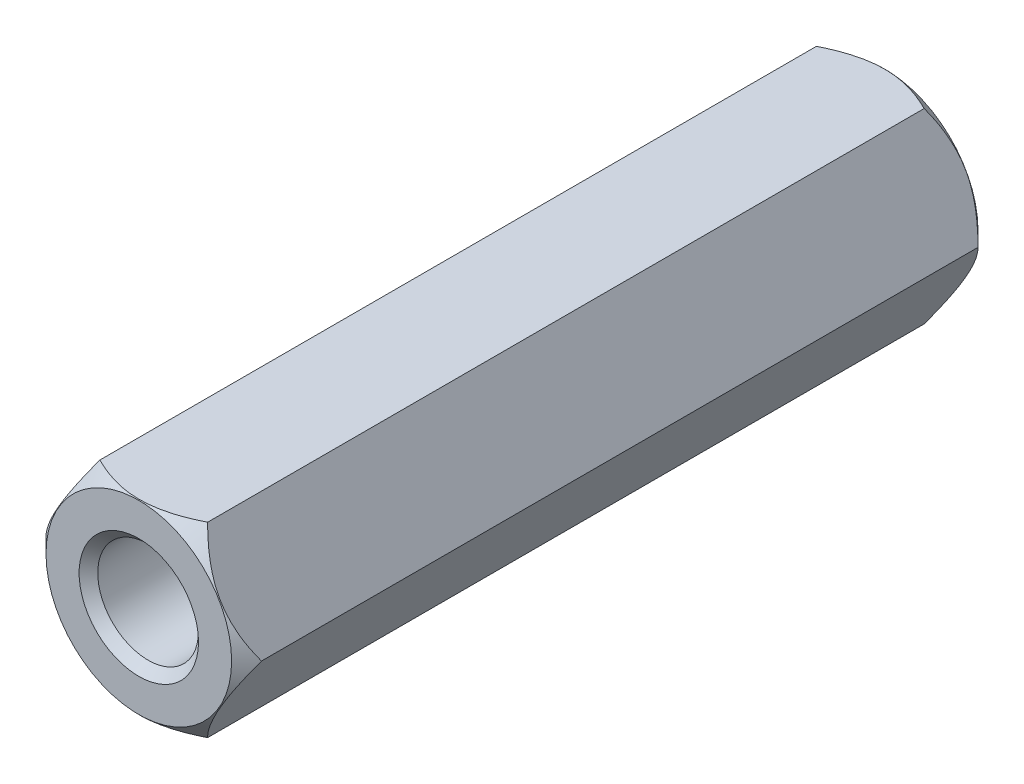
ISO-10303-21;
HEADER;
FILE_DESCRIPTION(('STEP AP214'),'2;1');
FILE_NAME('part.step','',(''),(''),'','','');
FILE_SCHEMA(('AUTOMOTIVE_DESIGN { 1 0 10303 214 1 1 1 1 }'));
ENDSEC;
DATA;
#1=APPLICATION_CONTEXT('core data for automotive mechanical design processes');
#2=APPLICATION_PROTOCOL_DEFINITION('international standard','automotive_design',2000,#1);
#3=PRODUCT_CONTEXT('',#1,'mechanical');
#4=PRODUCT('Part','Part','',(#3));
#5=PRODUCT_RELATED_PRODUCT_CATEGORY('part','',(#4));
#6=PRODUCT_DEFINITION_FORMATION('','',#4);
#7=PRODUCT_DEFINITION_CONTEXT('part definition',#1,'design');
#8=PRODUCT_DEFINITION('design','',#6,#7);
#9=PRODUCT_DEFINITION_SHAPE('','',#8);
#10=(LENGTH_UNIT() NAMED_UNIT(*) SI_UNIT(.MILLI.,.METRE.));
#11=(NAMED_UNIT(*) PLANE_ANGLE_UNIT() SI_UNIT($,.RADIAN.));
#12=(NAMED_UNIT(*) SI_UNIT($,.STERADIAN.) SOLID_ANGLE_UNIT());
#13=UNCERTAINTY_MEASURE_WITH_UNIT(LENGTH_MEASURE(1.E-05),#10,'distance_accuracy_value','');
#14=(GEOMETRIC_REPRESENTATION_CONTEXT(3) GLOBAL_UNCERTAINTY_ASSIGNED_CONTEXT((#13)) GLOBAL_UNIT_ASSIGNED_CONTEXT((#10,
#11,#12)) REPRESENTATION_CONTEXT('',''));
#15=CARTESIAN_POINT('',(0.,0.,0.));
#16=DIRECTION('',(0.,0.,1.));
#17=DIRECTION('',(1.,0.,0.));
#18=AXIS2_PLACEMENT_3D('',#15,#16,#17);
#19=CARTESIAN_POINT('',(1.44337567297409,-2.49999999999998,10.));
#20=DIRECTION('',(-0.866025403784442,0.499999999999995,0.));
#21=DIRECTION('',(-0.499999999999995,-0.866025403784442,0.));
#22=AXIS2_PLACEMENT_3D('',#19,#20,#21);
#23=PLANE('',#22);
#24=DIRECTION('',(0.,0.,1.));
#25=VECTOR('',#24,1.);
#26=CARTESIAN_POINT('',(1.44337567297409,-2.49999999999998,10.));
#27=LINE('',#26,#25);
#28=CARTESIAN_POINT('',(1.44337563618274,-2.49999999999998,9.60000001837968));
#29=VERTEX_POINT('',#28);
#30=CARTESIAN_POINT('',(1.44337569136929,-2.49999996813856,-9.6000000183792));
#31=VERTEX_POINT('',#30);
#32=EDGE_CURVE('E230',#29,#31,#27,.F.);
#33=ORIENTED_EDGE('',*,*,#32,.T.);
#34=CARTESIAN_POINT('',(2.88675134594212,-1.04069278974733E-11,-9.59999999999001));
#35=CARTESIAN_POINT('',(2.83714181918158,-0.0859262208991219,-9.64956191747157));
#36=CARTESIAN_POINT('',(2.786702820116,-0.173289129963614,-9.69621249947469));
#37=CARTESIAN_POINT('',(2.6838525248583,-0.351431066923417,-9.78162772360386));
#38=CARTESIAN_POINT('',(2.63143145294231,-0.442227026869141,-9.8203448562568));
#39=CARTESIAN_POINT('',(2.52572693266097,-0.625312626586108,-9.88666756505103));
#40=CARTESIAN_POINT('',(2.47247038953809,-0.717555665110433,-9.91443979581393));
#41=CARTESIAN_POINT('',(2.36478518620404,-0.90407190850839,-9.95722820692158));
#42=CARTESIAN_POINT('',(2.31035981325604,-0.998339419675211,-9.97227631522407));
#43=CARTESIAN_POINT('',(2.21655517569398,-1.16081381791828,-9.98585394949267));
#44=CARTESIAN_POINT('',(2.17729701313281,-1.22881095008603,-9.9878632717914));
#45=CARTESIAN_POINT('',(2.0988449207004,-1.36469396013906,-9.98447379973764));
#46=CARTESIAN_POINT('',(2.05965101816335,-1.43257979068014,-9.97907240877419));
#47=CARTESIAN_POINT('',(1.98163336093658,-1.56771033688439,-9.9611688890714));
#48=CARTESIAN_POINT('',(1.94281006951967,-1.63495425013553,-9.94865882136555));
#49=CARTESIAN_POINT('',(1.86583485788706,-1.76827922760658,-9.91722463177757));
#50=CARTESIAN_POINT('',(1.82768288641859,-1.83436038059889,-9.89830100180163));
#51=CARTESIAN_POINT('',(1.72998211153384,-2.00358308663813,-9.84213570260467));
#52=CARTESIAN_POINT('',(1.67103848733788,-2.10567643852777,-9.80066503729295));
#53=CARTESIAN_POINT('',(1.58436641863271,-2.25579686512223,-9.73065889047827));
#54=CARTESIAN_POINT('',(1.55580401039015,-2.30526840738488,-9.70606226599826));
#55=CARTESIAN_POINT('',(1.49920805534087,-2.40329547703312,-9.65462717783725));
#56=CARTESIAN_POINT('',(1.47117419715315,-2.45185154374643,-9.62779008808809));
#57=CARTESIAN_POINT('',(1.44337570976449,-2.49999993627714,-9.6000000367744));
#58=B_SPLINE_CURVE_WITH_KNOTS('',3,(#34,#35,#36,#37,#38,#39,#40,#41,#42,#43,#44,#45,#46,#47,#48,
#49,#50,#51,#52,#53,#54,#55,#56,#57),.UNSPECIFIED.,.F.,.F.,(4,2,2,2,2,2,2,2,2,2,2,4),(0.,
0.332957366238637,0.667853853239961,0.997433316819248,1.32618330924561,1.56147590701701,
1.79685096910278,2.03248941602696,2.26810979408609,2.64223178462184,2.82878531071778,
3.01522526436453),.UNSPECIFIED.);
#59=CARTESIAN_POINT('',(2.88675134596093,5.20299159348622E-12,-9.59999999996733));
#60=VERTEX_POINT('',#59);
#61=EDGE_CURVE('E95',#60,#31,#58,.T.);
#62=ORIENTED_EDGE('',*,*,#61,.F.);
#63=DIRECTION('',(0.,0.,1.));
#64=VECTOR('',#63,1.);
#65=CARTESIAN_POINT('',(2.88675134594813,0.,10.));
#66=LINE('',#65,#64);
#67=CARTESIAN_POINT('',(2.88675134596093,5.20345800689672E-12,9.59999999997188));
#68=VERTEX_POINT('',#67);
#69=EDGE_CURVE('E65',#60,#68,#66,.T.);
#70=ORIENTED_EDGE('',*,*,#69,.T.);
#71=CARTESIAN_POINT('',(1.44337563567651,-2.50000000332945,9.59999997242365));
#72=CARTESIAN_POINT('',(1.49298517776217,-2.41407379512151,9.64956189970784));
#73=CARTESIAN_POINT('',(1.54342418333656,-2.32671089091068,9.69621248639307));
#74=CARTESIAN_POINT('',(1.64627448377538,-2.14856895685125,9.78162771530144));
#75=CARTESIAN_POINT('',(1.69869555431559,-2.05777299491628,9.82034484803819));
#76=CARTESIAN_POINT('',(1.80440007385888,-1.87468739333832,9.88666755815194));
#77=CARTESIAN_POINT('',(1.8576566175802,-1.78244435492245,9.91443979016234));
#78=CARTESIAN_POINT('',(1.96534182164278,-1.59592811108585,9.95722820347616));
#79=CARTESIAN_POINT('',(2.01976719472307,-1.50166059937181,9.97227631272916));
#80=CARTESIAN_POINT('',(2.11357183230898,-1.33918620092785,9.9858539485665));
#81=CARTESIAN_POINT('',(2.15282999470135,-1.27118906910121,9.98786327156027));
#82=CARTESIAN_POINT('',(2.23128208679212,-1.1353060596756,9.98447380094104));
#83=CARTESIAN_POINT('',(2.27047598915637,-1.06742022942076,9.9790724107199));
#84=CARTESIAN_POINT('',(2.34849364612868,-0.932289683647671,9.96116889251074));
#85=CARTESIAN_POINT('',(2.38731693746344,-0.865045770542311,9.94865882554704));
#86=CARTESIAN_POINT('',(2.46429214896062,-0.731720793308433,9.91722463740315));
#87=CARTESIAN_POINT('',(2.50244412037571,-0.665639640407685,9.89830100812817));
#88=CARTESIAN_POINT('',(2.60014490400861,-0.49641691921513,9.84213570557291));
#89=CARTESIAN_POINT('',(2.65908853672397,-0.394323552569988,9.80066503408387));
#90=CARTESIAN_POINT('',(2.7457606176825,-0.244203104752272,9.73065887595901));
#91=CARTESIAN_POINT('',(2.77432302990582,-0.194731555594734,9.70606224738653));
#92=CARTESIAN_POINT('',(2.83091899276502,-0.0967044724192528,9.65462715050661));
#93=CARTESIAN_POINT('',(2.85895285478217,-0.0481483990731404,9.62779005613214));
#94=CARTESIAN_POINT('',(2.88675134594212,-1.04076022762005E-11,9.59999999999001));
#95=B_SPLINE_CURVE_WITH_KNOTS('',3,(#71,#72,#73,#74,#75,#76,#77,#78,#79,#80,#81,#82,#83,#84,#85,
#86,#87,#88,#89,#90,#91,#92,#93,#94),.UNSPECIFIED.,.F.,.F.,(4,2,2,2,2,2,2,2,2,2,2,4),(0.,
0.332957369514969,0.667853859275593,0.997433324550427,1.32618331889992,1.56147591560538,
1.79685097653576,2.03248942260823,2.26810979985238,2.64223184439946,2.82878539728016,
3.01522537763104),.UNSPECIFIED.);
#96=EDGE_CURVE('E94',#29,#68,#95,.T.);
#97=ORIENTED_EDGE('',*,*,#96,.F.);
#98=EDGE_LOOP('',(#33,#62,#70,#97));
#99=FACE_BOUND('',#98,.T.);
#100=ADVANCED_FACE('F47',(#99),#23,.F.);
#101=CARTESIAN_POINT('',(-1.44337567297404,-2.50000000000001,10.));
#102=DIRECTION('',(0.,1.,0.));
#103=DIRECTION('',(-1.,0.,0.));
#104=AXIS2_PLACEMENT_3D('',#101,#102,#103);
#105=PLANE('',#104);
#106=DIRECTION('',(0.,0.,1.));
#107=VECTOR('',#106,1.);
#108=CARTESIAN_POINT('',(-1.44337567297404,-2.50000000000002,10.));
#109=LINE('',#108,#107);
#110=CARTESIAN_POINT('',(-1.4433756913615,-2.49999996815201,9.60000001837146));
#111=VERTEX_POINT('',#110);
#112=CARTESIAN_POINT('',(-1.44337563619152,-2.50000000000002,-9.60000001837526));
#113=VERTEX_POINT('',#112);
#114=EDGE_CURVE('E351',#111,#113,#109,.F.);
#115=ORIENTED_EDGE('',*,*,#114,.T.);
#116=CARTESIAN_POINT('',(1.44337569453235,-2.49999996936722,-9.59999997241236));
#117=CARTESIAN_POINT('',(1.34415664439094,-2.49999998897752,-9.64956189966595));
#118=CARTESIAN_POINT('',(1.2432786472718,-2.49999999704033,-9.69621248632457));
#119=CARTESIAN_POINT('',(1.03757805680784,-2.50000000297688,-9.78162771519184));
#120=CARTESIAN_POINT('',(0.932735912008235,-2.50000000079102,-9.82034484791412));
#121=CARTESIAN_POINT('',(0.721326870207063,-2.49999999922152,-9.88666755805676));
#122=CARTESIAN_POINT('',(0.614813783688683,-2.49999999979395,-9.9144397900973));
#123=CARTESIAN_POINT('',(0.399443376138141,-2.50000000020552,-9.95722820345589));
#124=CARTESIAN_POINT('',(0.290592629631135,-2.5000000000465,-9.97227631272363));
#125=CARTESIAN_POINT('',(0.102983354225016,-2.49999999996672,-9.98585394856818));
#126=CARTESIAN_POINT('',(0.0244670294578231,-2.49999999999108,-9.98786327156152));
#127=CARTESIAN_POINT('',(-0.132437154742351,-2.50000000000892,-9.98447380093674));
#128=CARTESIAN_POINT('',(-0.210824959507029,-2.5000000000024,-9.97907241071048));
#129=CARTESIAN_POINT('',(-0.366860273459843,-2.49999999999761,-9.9611688924925));
#130=CARTESIAN_POINT('',(-0.444506856101901,-2.49999999999935,-9.94865882552954));
#131=CARTESIAN_POINT('',(-0.598457279045725,-2.50000000000066,-9.91722463739126));
#132=CARTESIAN_POINT('',(-0.674761221852855,-2.50000000000021,-9.89830100812125));
#133=CARTESIAN_POINT('',(-0.870162775880793,-2.49999999999968,-9.84213570937134));
#134=CARTESIAN_POINT('',(-0.988050028534472,-2.49999999999994,-9.80066504322648));
#135=CARTESIAN_POINT('',(-1.16139417205809,-2.50000000000004,-9.73065889456052));
#136=CARTESIAN_POINT('',(-1.21851899051716,-2.50000000000003,-9.70606226937212));
#137=CARTESIAN_POINT('',(-1.33171090448867,-2.5,-9.65462717963245));
#138=CARTESIAN_POINT('',(-1.38777862276322,-2.49999999999998,-9.62779008901326));
#139=CARTESIAN_POINT('',(-1.44337559940901,-2.50000000000001,-9.60000003676652));
#140=B_SPLINE_CURVE_WITH_KNOTS('',3,(#116,#117,#118,#119,#120,#121,#122,#123,#124,#125,#126,
#127,#128,#129,#130,#131,#132,#133,#134,#135,#136,#137,#138,#139),.UNSPECIFIED.,.F.,.F.,(4,2,2,
2,2,2,2,2,2,2,2,4),(0.,0.332957369311108,0.667853858868545,0.99743332436055,1.32618331892517,
1.56147591570433,1.79685097670962,2.03248942271044,2.26810979987908,2.6422318032004,
2.82878533557299,3.0152252954817),.UNSPECIFIED.);
#141=EDGE_CURVE('E256',#31,#113,#140,.T.);
#142=ORIENTED_EDGE('',*,*,#141,.F.);
#143=ORIENTED_EDGE('',*,*,#32,.F.);
#144=CARTESIAN_POINT('',(-1.44337569450378,-2.49999996937842,9.59999997243274));
#145=CARTESIAN_POINT('',(-1.34415664436238,-2.49999998898157,9.64956189968163));
#146=CARTESIAN_POINT('',(-1.24327864724414,-2.49999999704143,9.69621248633742));
#147=CARTESIAN_POINT('',(-1.03757805678284,-2.50000000297582,9.78162771520081));
#148=CARTESIAN_POINT('',(-0.932735911984984,-2.50000000079075,9.82034484792204));
#149=CARTESIAN_POINT('',(-0.721326870187105,-2.49999999922182,9.88666755806239));
#150=CARTESIAN_POINT('',(-0.614813783670263,-2.49999999979404,9.91443979010167));
#151=CARTESIAN_POINT('',(-0.399443376123012,-2.50000000020545,9.95722820345817));
#152=CARTESIAN_POINT('',(-0.290592629617759,-2.50000000004649,9.97227631272508));
#153=CARTESIAN_POINT('',(-0.102983354213352,-2.49999999996673,9.98585394856867));
#154=CARTESIAN_POINT('',(-0.0244670294460898,-2.49999999999108,9.98786327156164));
#155=CARTESIAN_POINT('',(0.132437154754195,-2.50000000000892,9.98447380093612));
#156=CARTESIAN_POINT('',(0.210824959518913,-2.50000000000239,9.97907241070948));
#157=CARTESIAN_POINT('',(0.366860273471757,-2.4999999999976,9.96116889249078));
#158=CARTESIAN_POINT('',(0.444506856113803,-2.49999999999934,9.94865882552746));
#159=CARTESIAN_POINT('',(0.598457279057579,-2.50000000000064,9.91722463738851));
#160=CARTESIAN_POINT('',(0.674761221864673,-2.5000000000002,9.89830100811818));
#161=CARTESIAN_POINT('',(0.870162775887302,-2.49999999999966,9.84213570936899));
#162=CARTESIAN_POINT('',(0.988050028535874,-2.49999999999992,9.8006650432258));
#163=CARTESIAN_POINT('',(1.16139417205213,-2.50000000000002,9.73065889456301));
#164=CARTESIAN_POINT('',(1.21851899050881,-2.5,9.70606226937577));
#165=CARTESIAN_POINT('',(1.33171090447562,-2.49999999999997,9.65462717963858));
#166=CARTESIAN_POINT('',(1.38777862274786,-2.49999999999995,9.62779008902071));
#167=CARTESIAN_POINT('',(1.44337559939138,-2.49999999999998,9.60000003677536));
#168=B_SPLINE_CURVE_WITH_KNOTS('',3,(#144,#145,#146,#147,#148,#149,#150,#151,#152,#153,#154,
#155,#156,#157,#158,#159,#160,#161,#162,#163,#164,#165,#166,#167),.UNSPECIFIED.,.F.,.F.,(4,2,2,
2,2,2,2,2,2,2,2,4),(0.,0.332957369305103,0.667853858856614,0.997433324343167,1.3261833189023,
1.56147591568163,1.79685097668713,2.03248942268809,2.26810979985685,2.64223180316216,
2.82878533552677,3.01522529542753),.UNSPECIFIED.);
#169=EDGE_CURVE('E110',#111,#29,#168,.T.);
#170=ORIENTED_EDGE('',*,*,#169,.F.);
#171=EDGE_LOOP('',(#115,#142,#143,#170));
#172=FACE_BOUND('',#171,.T.);
#173=ADVANCED_FACE('F182',(#172),#105,.F.);
#174=CARTESIAN_POINT('',(-2.88675134594813,0.,10.));
#175=DIRECTION('',(0.866025403784435,0.500000000000007,0.));
#176=DIRECTION('',(-0.500000000000007,0.866025403784435,0.));
#177=AXIS2_PLACEMENT_3D('',#174,#175,#176);
#178=PLANE('',#177);
#179=DIRECTION('',(0.,0.,1.));
#180=VECTOR('',#179,1.);
#181=CARTESIAN_POINT('',(-2.88675134594813,0.,10.));
#182=LINE('',#181,#180);
#183=CARTESIAN_POINT('',(-2.88675134591028,0.,9.60000000002253));
#184=VERTEX_POINT('',#183);
#185=CARTESIAN_POINT('',(-2.88675134596712,0.,-9.59999999997763));
#186=VERTEX_POINT('',#185);
#187=EDGE_CURVE('E348',#184,#186,#182,.F.);
#188=ORIENTED_EDGE('',*,*,#187,.T.);
#189=CARTESIAN_POINT('',(-1.44337563567834,-2.5000000033439,-9.59999997242273));
#190=CARTESIAN_POINT('',(-1.49298517776012,-2.41407379513137,-9.64956189970508));
#191=CARTESIAN_POINT('',(-1.54342418333319,-2.32671089091818,-9.69621248638993));
#192=CARTESIAN_POINT('',(-1.64627448377167,-2.14856895685591,-9.78162771529878));
#193=CARTESIAN_POINT('',(-1.69869555431288,-2.05777299492047,-9.82034484803638));
#194=CARTESIAN_POINT('',(-1.80440007385761,-1.87468739334093,-9.8866675581513));
#195=CARTESIAN_POINT('',(-1.85765661757937,-1.78244435492396,-9.91443979016202));
#196=CARTESIAN_POINT('',(-1.96534182164302,-1.59592811108528,-9.95722820347628));
#197=CARTESIAN_POINT('',(-2.01976719472393,-1.50166059937027,-9.97227631272942));
#198=CARTESIAN_POINT('',(-2.11357183231053,-1.33918620092517,-9.98585394856665));
#199=CARTESIAN_POINT('',(-2.15282999470296,-1.2711890690984,-9.98786327156032));
#200=CARTESIAN_POINT('',(-2.23128208679389,-1.13530605967251,-9.98447380094086));
#201=CARTESIAN_POINT('',(-2.27047598915823,-1.06742022941754,-9.9790724107196));
#202=CARTESIAN_POINT('',(-2.34849364613067,-0.932289683644209,-9.96116889251017));
#203=CARTESIAN_POINT('',(-2.38731693746549,-0.865045770538745,-9.94865882554632));
#204=CARTESIAN_POINT('',(-2.46429214896279,-0.731720793304673,-9.91722463740214));
#205=CARTESIAN_POINT('',(-2.50244412037794,-0.665639640403835,-9.89830100812701));
#206=CARTESIAN_POINT('',(-2.60014490401047,-0.496416919211915,-9.84213570557165));
#207=CARTESIAN_POINT('',(-2.65908853672542,-0.394323552567475,-9.80066503408277));
#208=CARTESIAN_POINT('',(-2.74576061768339,-0.244203104750755,-9.73065887595826));
#209=CARTESIAN_POINT('',(-2.77432302990652,-0.194731555593532,-9.7060622473859));
#210=CARTESIAN_POINT('',(-2.83091899276536,-0.0967044724186681,-9.65462715050628));
#211=CARTESIAN_POINT('',(-2.85895285478234,-0.0481483990728588,-9.62779005613197));
#212=CARTESIAN_POINT('',(-2.88675134594212,-1.04244571073003E-11,-9.59999999999001));
#213=B_SPLINE_CURVE_WITH_KNOTS('',3,(#189,#190,#191,#192,#193,#194,#195,#196,#197,#198,#199,
#200,#201,#202,#203,#204,#205,#206,#207,#208,#209,#210,#211,#212),.UNSPECIFIED.,.F.,.F.,(4,2,2,
2,2,2,2,2,2,2,2,4),(0.,0.332957369518247,0.66785385928239,0.997433324560808,1.32618331891378,
1.56147591561971,1.79685097655058,2.03248942262347,2.26810979986804,2.64223184441268,
2.82878539729223,3.01522537764195),.UNSPECIFIED.);
#214=EDGE_CURVE('E246',#113,#186,#213,.T.);
#215=ORIENTED_EDGE('',*,*,#214,.F.);
#216=ORIENTED_EDGE('',*,*,#114,.F.);
#217=CARTESIAN_POINT('',(-2.88675134594213,-1.0421331142993E-11,9.59999999999001));
#218=CARTESIAN_POINT('',(-2.83714181918156,-0.08592622089916,9.64956191747158));
#219=CARTESIAN_POINT('',(-2.78670282011598,-0.173289129963677,9.69621249947472));
#220=CARTESIAN_POINT('',(-2.68385252485824,-0.351431066923529,9.78162772360391));
#221=CARTESIAN_POINT('',(-2.63143145294223,-0.442227026869279,9.82034485625686));
#222=CARTESIAN_POINT('',(-2.52572693266089,-0.625312626586251,9.88666756505108));
#223=CARTESIAN_POINT('',(-2.47247038953802,-0.717555665110554,9.91443979581397));
#224=CARTESIAN_POINT('',(-2.36478518620399,-0.904071908508463,9.9572282069216));
#225=CARTESIAN_POINT('',(-2.31035981325601,-0.998339419675259,9.97227631522408));
#226=CARTESIAN_POINT('',(-2.21655517569396,-1.1608138179183,9.98585394949268));
#227=CARTESIAN_POINT('',(-2.1772970131328,-1.22881095008603,9.98786327179141));
#228=CARTESIAN_POINT('',(-2.09884492070039,-1.36469396013905,9.98447379973765));
#229=CARTESIAN_POINT('',(-2.05965101816334,-1.43257979068012,9.97907240877421));
#230=CARTESIAN_POINT('',(-1.98163336093658,-1.56771033688436,9.96116888907142));
#231=CARTESIAN_POINT('',(-1.94281006951966,-1.63495425013552,9.94865882136557));
#232=CARTESIAN_POINT('',(-1.86583485788704,-1.76827922760658,9.91722463177758));
#233=CARTESIAN_POINT('',(-1.82768288641857,-1.83436038059889,9.89830100180164));
#234=CARTESIAN_POINT('',(-1.72998211153102,-2.00358308664297,9.84213570260309));
#235=CARTESIAN_POINT('',(-1.67103848733237,-2.10567643853728,9.80066503728911));
#236=CARTESIAN_POINT('',(-1.58436641862332,-2.25579686513845,9.73065889047044));
#237=CARTESIAN_POINT('',(-1.5558040103795,-2.30526840740327,9.70606226598901));
#238=CARTESIAN_POINT('',(-1.49920805532774,-2.4032954770558,9.65462717782499));
#239=CARTESIAN_POINT('',(-1.47117419713881,-2.45185154377121,9.62779008807425));
#240=CARTESIAN_POINT('',(-1.44337570974895,-2.499999936304,9.60000003675891));
#241=B_SPLINE_CURVE_WITH_KNOTS('',3,(#217,#218,#219,#220,#221,#222,#223,#224,#225,#226,#227,
#228,#229,#230,#231,#232,#233,#234,#235,#236,#237,#238,#239,#240),.UNSPECIFIED.,.F.,.F.,(4,2,2,
2,2,2,2,2,2,2,2,4),(0.,0.332957366238732,0.667853853240151,0.997433316819356,1.32618330924564,
1.56147590701701,1.79685096910274,2.03248941602695,2.26810979408611,2.64223178463924,
2.82878531074382,3.01522526439918),.UNSPECIFIED.);
#242=EDGE_CURVE('E277',#184,#111,#241,.T.);
#243=ORIENTED_EDGE('',*,*,#242,.F.);
#244=EDGE_LOOP('',(#188,#215,#216,#243));
#245=FACE_BOUND('',#244,.T.);
#246=ADVANCED_FACE('F270',(#245),#178,.F.);
#247=CARTESIAN_POINT('',(-1.44337567297408,2.5,10.));
#248=DIRECTION('',(0.866025403784442,-0.499999999999995,0.));
#249=DIRECTION('',(0.499999999999995,0.866025403784442,0.));
#250=AXIS2_PLACEMENT_3D('',#247,#248,#249);
#251=PLANE('',#250);
#252=DIRECTION('',(0.,0.,1.));
#253=VECTOR('',#252,1.);
#254=CARTESIAN_POINT('',(-1.44337567297408,2.5,10.));
#255=LINE('',#254,#253);
#256=CARTESIAN_POINT('',(-1.44337563618427,2.5,9.60000001837891));
#257=VERTEX_POINT('',#256);
#258=CARTESIAN_POINT('',(-1.44337569135884,2.49999996815665,-9.60000001836877));
#259=VERTEX_POINT('',#258);
#260=EDGE_CURVE('E315',#257,#259,#255,.F.);
#261=ORIENTED_EDGE('',*,*,#260,.T.);
#262=CARTESIAN_POINT('',(-2.88675134594212,1.03893678407513E-11,-9.59999999999001));
#263=CARTESIAN_POINT('',(-2.83714181918156,0.0859262208991356,-9.64956191747159));
#264=CARTESIAN_POINT('',(-2.78670282011596,0.173289129963661,-9.69621249947473));
#265=CARTESIAN_POINT('',(-2.68385252485822,0.351431066923531,-9.78162772360392));
#266=CARTESIAN_POINT('',(-2.63143145294221,0.44222702686929,-9.82034485625688));
#267=CARTESIAN_POINT('',(-2.52572693266087,0.625312626586263,-9.88666756505109));
#268=CARTESIAN_POINT('',(-2.472470389538,0.717555665110557,-9.91443979581398));
#269=CARTESIAN_POINT('',(-2.36478518620399,0.904071908508449,-9.9572282069216));
#270=CARTESIAN_POINT('',(-2.31035981325601,0.998339419675238,-9.97227631522408));
#271=CARTESIAN_POINT('',(-2.21655517569398,1.16081381791827,-9.98585394949268));
#272=CARTESIAN_POINT('',(-2.17729701313282,1.228810950086,-9.98786327179141));
#273=CARTESIAN_POINT('',(-2.09884492070042,1.36469396013901,-9.98447379973765));
#274=CARTESIAN_POINT('',(-2.05965101816337,1.43257979068007,-9.97907240877421));
#275=CARTESIAN_POINT('',(-1.98163336093661,1.56771033688432,-9.96116888907142));
#276=CARTESIAN_POINT('',(-1.94281006951969,1.63495425013548,-9.94865882136557));
#277=CARTESIAN_POINT('',(-1.86583485788707,1.76827922760654,-9.91722463177759));
#278=CARTESIAN_POINT('',(-1.82768288641859,1.83436038059887,-9.89830100180164));
#279=CARTESIAN_POINT('',(-1.72998211153008,2.00358308664462,-9.84213570260253));
#280=CARTESIAN_POINT('',(-1.6710384873305,2.10567643854055,-9.80066503728777));
#281=CARTESIAN_POINT('',(-1.58436641862011,2.25579686514405,-9.73065889046772));
#282=CARTESIAN_POINT('',(-1.55580401037584,2.30526840740964,-9.70606226598579));
#283=CARTESIAN_POINT('',(-1.49920805532323,2.40329547706365,-9.65462717782073));
#284=CARTESIAN_POINT('',(-1.47117419713387,2.4518515437798,-9.62779008806943));
#285=CARTESIAN_POINT('',(-1.44337570974361,2.4999999363133,-9.60000003675353));
#286=B_SPLINE_CURVE_WITH_KNOTS('',3,(#262,#263,#264,#265,#266,#267,#268,#269,#270,#271,#272,
#273,#274,#275,#276,#277,#278,#279,#280,#281,#282,#283,#284,#285),.UNSPECIFIED.,.F.,.F.,(4,2,2,
2,2,2,2,2,2,2,2,4),(0.,0.33295736623876,0.667853853240207,0.997433316819378,1.32618330924563,
1.56147590701699,1.79685096910271,2.03248941602693,2.2681097940861,2.64223178464526,
2.82878531075285,3.0152252644112),.UNSPECIFIED.);
#287=EDGE_CURVE('E255',#186,#259,#286,.T.);
#288=ORIENTED_EDGE('',*,*,#287,.F.);
#289=ORIENTED_EDGE('',*,*,#187,.F.);
#290=CARTESIAN_POINT('',(-1.44337563567889,2.50000000332755,9.5999999724257));
#291=CARTESIAN_POINT('',(-1.49298517776393,2.41407379511924,9.64956189970941));
#292=CARTESIAN_POINT('',(-1.54342418333802,2.32671089090834,9.69621248639436));
#293=CARTESIAN_POINT('',(-1.64627448377653,2.14856895684903,9.78162771530234));
#294=CARTESIAN_POINT('',(-1.69869555431671,2.05777299491425,9.82034484803899));
#295=CARTESIAN_POINT('',(-1.80440007385989,1.8746873933366,9.88666755815251));
#296=CARTESIAN_POINT('',(-1.85765661758111,1.78244435492086,9.91443979016279));
#297=CARTESIAN_POINT('',(-1.96534182164352,1.59592811108453,9.95722820347639));
#298=CARTESIAN_POINT('',(-2.01976719472373,1.50166059937065,9.97227631272931));
#299=CARTESIAN_POINT('',(-2.11357183230956,1.33918620092684,9.98585394856656));
#300=CARTESIAN_POINT('',(-2.15282999470192,1.2711890691002,9.9878632715603));
#301=CARTESIAN_POINT('',(-2.2312820867927,1.13530605967458,9.98447380094099));
#302=CARTESIAN_POINT('',(-2.27047598915695,1.06742022941974,9.97907241071982));
#303=CARTESIAN_POINT('',(-2.34849364612926,0.932289683646644,9.96116889251058));
#304=CARTESIAN_POINT('',(-2.38731693746402,0.865045770541284,9.94865882554684));
#305=CARTESIAN_POINT('',(-2.4642921489612,0.731720793307409,9.91722463740289));
#306=CARTESIAN_POINT('',(-2.50244412037629,0.665639640406664,9.89830100812787));
#307=CARTESIAN_POINT('',(-2.60014490400909,0.496416919214292,9.8421357055726));
#308=CARTESIAN_POINT('',(-2.65908853672434,0.394323552569324,9.8006650340836));
#309=CARTESIAN_POINT('',(-2.74576061768273,0.244203104751859,9.73065887595882));
#310=CARTESIAN_POINT('',(-2.774323029906,0.194731555594404,9.70606224738637));
#311=CARTESIAN_POINT('',(-2.8309189927651,0.0967044724190823,9.65462715050653));
#312=CARTESIAN_POINT('',(-2.85895285478221,0.0481483990730485,9.6277900561321));
#313=CARTESIAN_POINT('',(-2.88675134594212,1.03931354055646E-11,9.59999999999002));
#314=B_SPLINE_CURVE_WITH_KNOTS('',3,(#290,#291,#292,#293,#294,#295,#296,#297,#298,#299,#300,
#301,#302,#303,#304,#305,#306,#307,#308,#309,#310,#311,#312,#313),.UNSPECIFIED.,.F.,.F.,(4,2,2,
2,2,2,2,2,2,2,2,4),(0.,0.332957369514379,0.667853859274418,0.997433324548704,1.32618331889765,
1.56147591560312,1.79685097653352,2.032489422606,2.26810979985017,2.64223184439664,
2.82878539727705,3.01522537762762),.UNSPECIFIED.);
#315=EDGE_CURVE('E121',#257,#184,#314,.T.);
#316=ORIENTED_EDGE('',*,*,#315,.F.);
#317=EDGE_LOOP('',(#261,#288,#289,#316));
#318=FACE_BOUND('',#317,.T.);
#319=ADVANCED_FACE('F273',(#318),#251,.F.);
#320=CARTESIAN_POINT('',(1.44337567297406,2.50000000000001,10.));
#321=DIRECTION('',(0.,-1.,0.));
#322=DIRECTION('',(1.,0.,0.));
#323=AXIS2_PLACEMENT_3D('',#320,#321,#322);
#324=PLANE('',#323);
#325=DIRECTION('',(0.,0.,1.));
#326=VECTOR('',#325,1.);
#327=CARTESIAN_POINT('',(1.44337567297406,2.50000000000001,10.));
#328=LINE('',#327,#326);
#329=CARTESIAN_POINT('',(1.44337569136906,2.49999996813893,9.600000018379));
#330=VERTEX_POINT('',#329);
#331=CARTESIAN_POINT('',(1.44337563618425,2.50000000000001,-9.60000001837891));
#332=VERTEX_POINT('',#331);
#333=EDGE_CURVE('E98',#330,#332,#328,.F.);
#334=ORIENTED_EDGE('',*,*,#333,.T.);
#335=CARTESIAN_POINT('',(-1.44337569454955,2.49999996938721,-9.5999999724147));
#336=CARTESIAN_POINT('',(-1.34415664440409,2.49999998898472,-9.64956189966365));
#337=CARTESIAN_POINT('',(-1.24327864728238,2.49999999704227,-9.69621248632093));
#338=CARTESIAN_POINT('',(-1.03757805681442,2.50000000297495,-9.78162771518835));
#339=CARTESIAN_POINT('',(-0.932735912013363,2.50000000079051,-9.82034484791212));
#340=CARTESIAN_POINT('',(-0.7213268702087,2.49999999922204,-9.88666755805663));
#341=CARTESIAN_POINT('',(-0.614813783688283,2.49999999979409,-9.91443979009754));
#342=CARTESIAN_POINT('',(-0.399443376133744,2.50000000020539,-9.9572282034566));
#343=CARTESIAN_POINT('',(-0.290592629624779,2.50000000004647,-9.97227631272443));
#344=CARTESIAN_POINT('',(-0.102983354216355,2.49999999996674,-9.98585394856856));
#345=CARTESIAN_POINT('',(-0.0244670294488241,2.49999999999109,-9.98786327156162));
#346=CARTESIAN_POINT('',(0.132437154752012,2.50000000000892,-9.98447380093624));
#347=CARTESIAN_POINT('',(0.210824959517014,2.50000000000239,-9.97907241070965));
#348=CARTESIAN_POINT('',(0.366860273470386,2.49999999999761,-9.96116889249098));
#349=CARTESIAN_POINT('',(0.444506856112679,2.49999999999935,-9.94865882552766));
#350=CARTESIAN_POINT('',(0.598457279056937,2.50000000000065,-9.91722463738866));
#351=CARTESIAN_POINT('',(0.674761221864266,2.50000000000021,-9.89830100811828));
#352=CARTESIAN_POINT('',(0.870162775887673,2.49999999999967,-9.84213570936888));
#353=CARTESIAN_POINT('',(0.988050028536773,2.49999999999994,-9.80066504322548));
#354=CARTESIAN_POINT('',(1.16139417205383,2.50000000000004,-9.73065889456229));
#355=CARTESIAN_POINT('',(1.21851899051079,2.50000000000002,-9.70606226937489));
#356=CARTESIAN_POINT('',(1.33171090447815,2.49999999999999,-9.65462717963737));
#357=CARTESIAN_POINT('',(1.38777862275066,2.49999999999997,-9.62779008901934));
#358=CARTESIAN_POINT('',(1.44337559939445,2.50000000000001,-9.60000003677381));
#359=B_SPLINE_CURVE_WITH_KNOTS('',3,(#335,#336,#337,#338,#339,#340,#341,#342,#343,#344,#345,
#346,#347,#348,#349,#350,#351,#352,#353,#354,#355,#356,#357,#358),.UNSPECIFIED.,.F.,.F.,(4,2,2,
2,2,2,2,2,2,2,2,4),(0.,0.332957369316385,0.667853858879602,0.997433324377676,1.32618331894815,
1.56147591572828,1.79685097673461,2.0324894227363,2.26810979990578,2.64223180321278,
2.82878533557836,3.01522529548007),.UNSPECIFIED.);
#360=EDGE_CURVE('E291',#259,#332,#359,.T.);
#361=ORIENTED_EDGE('',*,*,#360,.F.);
#362=ORIENTED_EDGE('',*,*,#260,.F.);
#363=CARTESIAN_POINT('',(1.44337569450376,2.49999996936506,9.59999997242544));
#364=CARTESIAN_POINT('',(1.34415664436439,2.49999998897676,9.64956189967806));
#365=CARTESIAN_POINT('',(1.24327864724717,2.49999999704014,9.69621248633538));
#366=CARTESIAN_POINT('',(1.03757805678709,2.50000000297711,9.78162771519985));
#367=CARTESIAN_POINT('',(0.932735911989445,2.50000000079109,9.82034484792064));
#368=CARTESIAN_POINT('',(0.721326870192324,2.49999999922148,9.88666755806075));
#369=CARTESIAN_POINT('',(0.61481378367603,2.49999999979395,9.91443979010023));
#370=CARTESIAN_POINT('',(0.39944337612977,2.50000000020554,9.95722820345713));
#371=CARTESIAN_POINT('',(0.29059262962496,2.5000000000465,9.97227631272424));
#372=CARTESIAN_POINT('',(0.102983354221179,2.49999999996672,9.98585394856834));
#373=CARTESIAN_POINT('',(0.0244670294541032,2.49999999999108,9.98786327156155));
#374=CARTESIAN_POINT('',(-0.132437154745824,2.50000000000892,9.98447380093656));
#375=CARTESIAN_POINT('',(-0.210824959510371,2.50000000000239,9.97907241071019));
#376=CARTESIAN_POINT('',(-0.366860273462926,2.4999999999976,9.96116889249205));
#377=CARTESIAN_POINT('',(-0.444506856104856,2.49999999999935,9.94865882552903));
#378=CARTESIAN_POINT('',(-0.598457279048423,2.50000000000065,9.91722463739064));
#379=CARTESIAN_POINT('',(-0.674761221855425,2.50000000000021,9.89830100812059));
#380=CARTESIAN_POINT('',(-0.870162775880205,2.49999999999967,9.84213570937142));
#381=CARTESIAN_POINT('',(-0.988050028530952,2.49999999999993,9.80066504322768));
#382=CARTESIAN_POINT('',(-1.16139417205033,2.50000000000003,9.73065889456378));
#383=CARTESIAN_POINT('',(-1.21851899050801,2.50000000000001,9.70606226937613));
#384=CARTESIAN_POINT('',(-1.33171090447679,2.49999999999998,9.65462717963804));
#385=CARTESIAN_POINT('',(-1.38777862274999,2.49999999999996,9.62779008901968));
#386=CARTESIAN_POINT('',(-1.44337559939446,2.5,9.60000003677381));
#387=B_SPLINE_CURVE_WITH_KNOTS('',3,(#363,#364,#365,#366,#367,#368,#369,#370,#371,#372,#373,
#374,#375,#376,#377,#378,#379,#380,#381,#382,#383,#384,#385,#386),.UNSPECIFIED.,.F.,.F.,(4,2,2,
2,2,2,2,2,2,2,2,4),(0.,0.332957369304244,0.667853858854618,0.997433324339804,1.32618331889769,
1.56147591567649,1.79685097668142,2.03248942268189,2.26810979985019,2.64223180316214,
2.82878533553001,3.01522529543401),.UNSPECIFIED.);
#388=EDGE_CURVE('E117',#330,#257,#387,.T.);
#389=ORIENTED_EDGE('',*,*,#388,.F.);
#390=EDGE_LOOP('',(#334,#361,#362,#389));
#391=FACE_BOUND('',#390,.T.);
#392=ADVANCED_FACE('F303',(#391),#324,.F.);
#393=CARTESIAN_POINT('',(2.88675134594813,0.,10.));
#394=DIRECTION('',(-0.866025403784438,-0.500000000000001,0.));
#395=DIRECTION('',(0.500000000000001,-0.866025403784438,0.));
#396=AXIS2_PLACEMENT_3D('',#393,#394,#395);
#397=PLANE('',#396);
#398=ORIENTED_EDGE('',*,*,#69,.F.);
#399=CARTESIAN_POINT('',(1.44337563567887,2.50000000332756,-9.5999999724257));
#400=CARTESIAN_POINT('',(1.49298517776391,2.41407379511926,-9.64956189970941));
#401=CARTESIAN_POINT('',(1.54342418333801,2.32671089090836,-9.69621248639436));
#402=CARTESIAN_POINT('',(1.64627448377651,2.14856895684904,-9.78162771530234));
#403=CARTESIAN_POINT('',(1.6986955543167,2.05777299491426,-9.82034484803899));
#404=CARTESIAN_POINT('',(1.80440007385988,1.87468739333662,-9.88666755815251));
#405=CARTESIAN_POINT('',(1.8576566175811,1.78244435492087,-9.91443979016279));
#406=CARTESIAN_POINT('',(1.96534182164351,1.59592811108455,-9.95722820347639));
#407=CARTESIAN_POINT('',(2.01976719472372,1.50166059937066,-9.97227631272931));
#408=CARTESIAN_POINT('',(2.11357183230955,1.33918620092685,-9.98585394856656));
#409=CARTESIAN_POINT('',(2.15282999470191,1.27118906910021,-9.9878632715603));
#410=CARTESIAN_POINT('',(2.23128208679269,1.1353060596746,-9.98447380094099));
#411=CARTESIAN_POINT('',(2.27047598915695,1.06742022941975,-9.97907241071982));
#412=CARTESIAN_POINT('',(2.34849364612925,0.93228968364666,-9.96116889251058));
#413=CARTESIAN_POINT('',(2.38731693746401,0.8650457705413,-9.94865882554684));
#414=CARTESIAN_POINT('',(2.46429214896119,0.731720793307426,-9.91722463740289));
#415=CARTESIAN_POINT('',(2.50244412037629,0.665639640406682,-9.89830100812787));
#416=CARTESIAN_POINT('',(2.60014490400908,0.496416919214309,-9.8421357055726));
#417=CARTESIAN_POINT('',(2.65908853672434,0.39432355256934,-9.8006650340836));
#418=CARTESIAN_POINT('',(2.74576061768273,0.244203104751874,-9.73065887595882));
#419=CARTESIAN_POINT('',(2.774323029906,0.194731555594418,-9.70606224738637));
#420=CARTESIAN_POINT('',(2.83091899276511,0.096704472419096,-9.65462715050653));
#421=CARTESIAN_POINT('',(2.85895285478221,0.0481483990730619,-9.6277900561321));
#422=CARTESIAN_POINT('',(2.88675134594212,1.04064325767278E-11,-9.59999999999001));
#423=B_SPLINE_CURVE_WITH_KNOTS('',3,(#399,#400,#401,#402,#403,#404,#405,#406,#407,#408,#409,
#410,#411,#412,#413,#414,#415,#416,#417,#418,#419,#420,#421,#422),.UNSPECIFIED.,.F.,.F.,(4,2,2,
2,2,2,2,2,2,2,2,4),(0.,0.332957369514378,0.667853859274418,0.997433324548705,1.32618331889765,
1.56147591560313,1.79685097653352,2.032489422606,2.26810979985017,2.64223184439665,
2.82878539727706,3.01522537762763),.UNSPECIFIED.);
#424=EDGE_CURVE('E226',#332,#60,#423,.T.);
#425=ORIENTED_EDGE('',*,*,#424,.F.);
#426=ORIENTED_EDGE('',*,*,#333,.F.);
#427=CARTESIAN_POINT('',(2.88675134594212,1.04072915376139E-11,9.59999999999001));
#428=CARTESIAN_POINT('',(2.83714181918157,0.0859262208991235,9.64956191747157));
#429=CARTESIAN_POINT('',(2.786702820116,0.173289129963618,9.6962124994747));
#430=CARTESIAN_POINT('',(2.68385252485829,0.351431066923422,9.78162772360386));
#431=CARTESIAN_POINT('',(2.6314314529423,0.442227026869147,9.82034485625681));
#432=CARTESIAN_POINT('',(2.52572693266096,0.625312626586115,9.88666756505104));
#433=CARTESIAN_POINT('',(2.47247038953808,0.717555665110441,9.91443979581394));
#434=CARTESIAN_POINT('',(2.36478518620403,0.904071908508397,9.95722820692159));
#435=CARTESIAN_POINT('',(2.31035981325603,0.998339419675218,9.97227631522408));
#436=CARTESIAN_POINT('',(2.21655517569397,1.16081381791829,9.98585394949268));
#437=CARTESIAN_POINT('',(2.1772970131328,1.22881095008603,9.98786327179141));
#438=CARTESIAN_POINT('',(2.09884492070038,1.36469396013907,9.98447379973765));
#439=CARTESIAN_POINT('',(2.05965101816333,1.43257979068014,9.9790724087742));
#440=CARTESIAN_POINT('',(1.98163336093657,1.56771033688439,9.96116888907141));
#441=CARTESIAN_POINT('',(1.94281006951965,1.63495425013554,9.94865882136556));
#442=CARTESIAN_POINT('',(1.86583485788705,1.76827922760658,9.91722463177758));
#443=CARTESIAN_POINT('',(1.82768288641858,1.83436038059889,9.89830100180164));
#444=CARTESIAN_POINT('',(1.72998211153375,2.00358308663826,9.84213570260464));
#445=CARTESIAN_POINT('',(1.67103848733772,2.10567643852803,9.80066503729286));
#446=CARTESIAN_POINT('',(1.58436641863244,2.25579686512266,9.73065889047807));
#447=CARTESIAN_POINT('',(1.55580401038985,2.30526840738536,9.70606226599803));
#448=CARTESIAN_POINT('',(1.4992080553405,2.40329547703372,9.65462717783694));
#449=CARTESIAN_POINT('',(1.47117419715275,2.45185154374708,9.62779008808774));
#450=CARTESIAN_POINT('',(1.44337570976406,2.49999993627785,9.60000003677401));
#451=B_SPLINE_CURVE_WITH_KNOTS('',3,(#427,#428,#429,#430,#431,#432,#433,#434,#435,#436,#437,
#438,#439,#440,#441,#442,#443,#444,#445,#446,#447,#448,#449,#450),.UNSPECIFIED.,.F.,.F.,(4,2,2,
2,2,2,2,2,2,2,2,4),(0.,0.332957366238643,0.667853853239973,0.997433316819262,1.32618330924563,
1.56147590701703,1.79685096910279,2.03248941602697,2.2681097940861,2.64223178462232,
2.82878531071848,3.01522526436545),.UNSPECIFIED.);
#452=EDGE_CURVE('E97',#68,#330,#451,.T.);
#453=ORIENTED_EDGE('',*,*,#452,.F.);
#454=EDGE_LOOP('',(#398,#425,#426,#453));
#455=FACE_BOUND('',#454,.T.);
#456=ADVANCED_FACE('F114',(#455),#397,.F.);
#457=CARTESIAN_POINT('',(0.,0.,9.59760000000642));
#458=DIRECTION('',(0.,0.,-1.));
#459=DIRECTION('',(-1.,0.,0.));
#460=AXIS2_PLACEMENT_3D('',#457,#458,#459);
#461=CONICAL_SURFACE('',#460,2.88915134592571,0.785398163397448);
#462=ORIENTED_EDGE('',*,*,#315,.T.);
#463=ORIENTED_EDGE('',*,*,#242,.T.);
#464=ORIENTED_EDGE('',*,*,#169,.T.);
#465=ORIENTED_EDGE('',*,*,#96,.T.);
#466=ORIENTED_EDGE('',*,*,#452,.T.);
#467=ORIENTED_EDGE('',*,*,#388,.T.);
#468=EDGE_LOOP('',(#462,#463,#464,#465,#466,#467));
#469=FACE_BOUND('',#468,.T.);
#470=CARTESIAN_POINT('',(0.,0.,9.99999999999091));
#471=DIRECTION('',(0.,0.,-1.));
#472=DIRECTION('',(-1.,0.,0.));
#473=AXIS2_PLACEMENT_3D('',#470,#471,#472);
#474=CIRCLE('',#473,2.48675134594123);
#475=CARTESIAN_POINT('',(-2.48675134594123,0.,9.99999999999091));
#476=VERTEX_POINT('',#475);
#477=EDGE_CURVE('E219',#476,#476,#474,.F.);
#478=ORIENTED_EDGE('',*,*,#477,.F.);
#479=EDGE_LOOP('',(#478));
#480=FACE_BOUND('',#479,.T.);
#481=ADVANCED_FACE('F104',(#469,#480),#461,.T.);
#482=CARTESIAN_POINT('',(0.,0.,-9.59760000000642));
#483=DIRECTION('',(0.,0.,1.));
#484=DIRECTION('',(1.,0.,0.));
#485=AXIS2_PLACEMENT_3D('',#482,#483,#484);
#486=CONICAL_SURFACE('',#485,2.88915134592571,0.785398163397448);
#487=ORIENTED_EDGE('',*,*,#214,.T.);
#488=ORIENTED_EDGE('',*,*,#287,.T.);
#489=ORIENTED_EDGE('',*,*,#360,.T.);
#490=ORIENTED_EDGE('',*,*,#424,.T.);
#491=ORIENTED_EDGE('',*,*,#61,.T.);
#492=ORIENTED_EDGE('',*,*,#141,.T.);
#493=EDGE_LOOP('',(#487,#488,#489,#490,#491,#492));
#494=FACE_BOUND('',#493,.T.);
#495=CARTESIAN_POINT('',(0.,0.,-9.99999999999091));
#496=DIRECTION('',(0.,0.,1.));
#497=DIRECTION('',(1.,0.,0.));
#498=AXIS2_PLACEMENT_3D('',#495,#496,#497);
#499=CIRCLE('',#498,2.48675134594123);
#500=CARTESIAN_POINT('',(2.48675134594123,0.,-9.99999999999091));
#501=VERTEX_POINT('',#500);
#502=EDGE_CURVE('E216',#501,#501,#499,.T.);
#503=ORIENTED_EDGE('',*,*,#502,.T.);
#504=EDGE_LOOP('',(#503));
#505=FACE_BOUND('',#504,.T.);
#506=ADVANCED_FACE('F145',(#494,#505),#486,.T.);
#507=CARTESIAN_POINT('',(0.,0.,10.));
#508=DIRECTION('',(0.,0.,1.));
#509=DIRECTION('',(1.,0.,0.));
#510=AXIS2_PLACEMENT_3D('',#507,#508,#509);
#511=PLANE('',#510);
#512=CARTESIAN_POINT('',(0.,0.,10.));
#513=DIRECTION('',(0.,0.,1.));
#514=DIRECTION('',(1.,0.,0.));
#515=AXIS2_PLACEMENT_3D('',#512,#513,#514);
#516=CIRCLE('',#515,1.60000000003455);
#517=CARTESIAN_POINT('',(1.60000000003455,0.,10.));
#518=VERTEX_POINT('',#517);
#519=EDGE_CURVE('E12',#518,#518,#516,.F.);
#520=ORIENTED_EDGE('',*,*,#519,.T.);
#521=EDGE_LOOP('',(#520));
#522=FACE_BOUND('',#521,.T.);
#523=ORIENTED_EDGE('',*,*,#477,.T.);
#524=EDGE_LOOP('',(#523));
#525=FACE_BOUND('',#524,.T.);
#526=ADVANCED_FACE('F204',(#522,#525),#511,.T.);
#527=CARTESIAN_POINT('',(0.,0.,-10.));
#528=DIRECTION('',(0.,0.,1.));
#529=DIRECTION('',(1.,0.,0.));
#530=AXIS2_PLACEMENT_3D('',#527,#528,#529);
#531=PLANE('',#530);
#532=CARTESIAN_POINT('',(0.,0.,-10.));
#533=DIRECTION('',(0.,0.,1.));
#534=DIRECTION('',(1.,0.,0.));
#535=AXIS2_PLACEMENT_3D('',#532,#533,#534);
#536=CIRCLE('',#535,1.60000000004365);
#537=CARTESIAN_POINT('',(1.60000000004365,0.,-10.));
#538=VERTEX_POINT('',#537);
#539=EDGE_CURVE('E138',#538,#538,#536,.T.);
#540=ORIENTED_EDGE('',*,*,#539,.T.);
#541=EDGE_LOOP('',(#540));
#542=FACE_BOUND('',#541,.T.);
#543=ORIENTED_EDGE('',*,*,#502,.F.);
#544=EDGE_LOOP('',(#543));
#545=FACE_BOUND('',#544,.T.);
#546=ADVANCED_FACE('F198',(#542,#545),#531,.F.);
#547=CARTESIAN_POINT('',(0.,0.,10.));
#548=DIRECTION('',(0.,0.,1.));
#549=DIRECTION('',(1.,0.,0.));
#550=AXIS2_PLACEMENT_3D('',#547,#548,#549);
#551=CYLINDRICAL_SURFACE('',#550,1.35);
#552=CARTESIAN_POINT('',(0.,0.,-9.74999999995635));
#553=DIRECTION('',(0.,0.,1.));
#554=DIRECTION('',(1.,0.,0.));
#555=AXIS2_PLACEMENT_3D('',#552,#553,#554);
#556=CIRCLE('',#555,1.35);
#557=CARTESIAN_POINT('',(1.35,0.,-9.74999999995635));
#558=VERTEX_POINT('',#557);
#559=EDGE_CURVE('E57',#558,#558,#556,.F.);
#560=ORIENTED_EDGE('',*,*,#559,.T.);
#561=EDGE_LOOP('',(#560));
#562=FACE_BOUND('',#561,.T.);
#563=CARTESIAN_POINT('',(0.,0.,9.74999999996545));
#564=DIRECTION('',(0.,0.,1.));
#565=DIRECTION('',(1.,0.,0.));
#566=AXIS2_PLACEMENT_3D('',#563,#564,#565);
#567=CIRCLE('',#566,1.35);
#568=CARTESIAN_POINT('',(1.35,0.,9.74999999996545));
#569=VERTEX_POINT('',#568);
#570=EDGE_CURVE('E224',#569,#569,#567,.T.);
#571=ORIENTED_EDGE('',*,*,#570,.T.);
#572=EDGE_LOOP('',(#571));
#573=FACE_BOUND('',#572,.T.);
#574=ADVANCED_FACE('F183',(#562,#573),#551,.F.);
#575=CARTESIAN_POINT('',(0.,0.,-10.));
#576=DIRECTION('',(0.,0.,-1.));
#577=DIRECTION('',(-1.,0.,0.));
#578=AXIS2_PLACEMENT_3D('',#575,#576,#577);
#579=CONICAL_SURFACE('',#578,1.60000000004365,0.785398163397446);
#580=ORIENTED_EDGE('',*,*,#559,.F.);
#581=EDGE_LOOP('',(#580));
#582=FACE_BOUND('',#581,.T.);
#583=ORIENTED_EDGE('',*,*,#539,.F.);
#584=EDGE_LOOP('',(#583));
#585=FACE_BOUND('',#584,.T.);
#586=ADVANCED_FACE('F187',(#582,#585),#579,.F.);
#587=CARTESIAN_POINT('',(0.,0.,9.74999999996545));
#588=DIRECTION('',(0.,0.,1.));
#589=DIRECTION('',(1.,0.,0.));
#590=AXIS2_PLACEMENT_3D('',#587,#588,#589);
#591=CONICAL_SURFACE('',#590,1.35,0.785398163397456);
#592=ORIENTED_EDGE('',*,*,#519,.F.);
#593=EDGE_LOOP('',(#592));
#594=FACE_BOUND('',#593,.T.);
#595=ORIENTED_EDGE('',*,*,#570,.F.);
#596=EDGE_LOOP('',(#595));
#597=FACE_BOUND('',#596,.T.);
#598=ADVANCED_FACE('F50',(#594,#597),#591,.F.);
#599=CLOSED_SHELL('',(#100,#173,#246,#319,#392,#456,#481,#506,#526,#546,#574,#586,#598));
#600=MANIFOLD_SOLID_BREP('B2',#599);
#601=ADVANCED_BREP_SHAPE_REPRESENTATION('',(#18,#600),#14);
#602=SHAPE_DEFINITION_REPRESENTATION(#9,#601);
ENDSEC;
END-ISO-10303-21;
